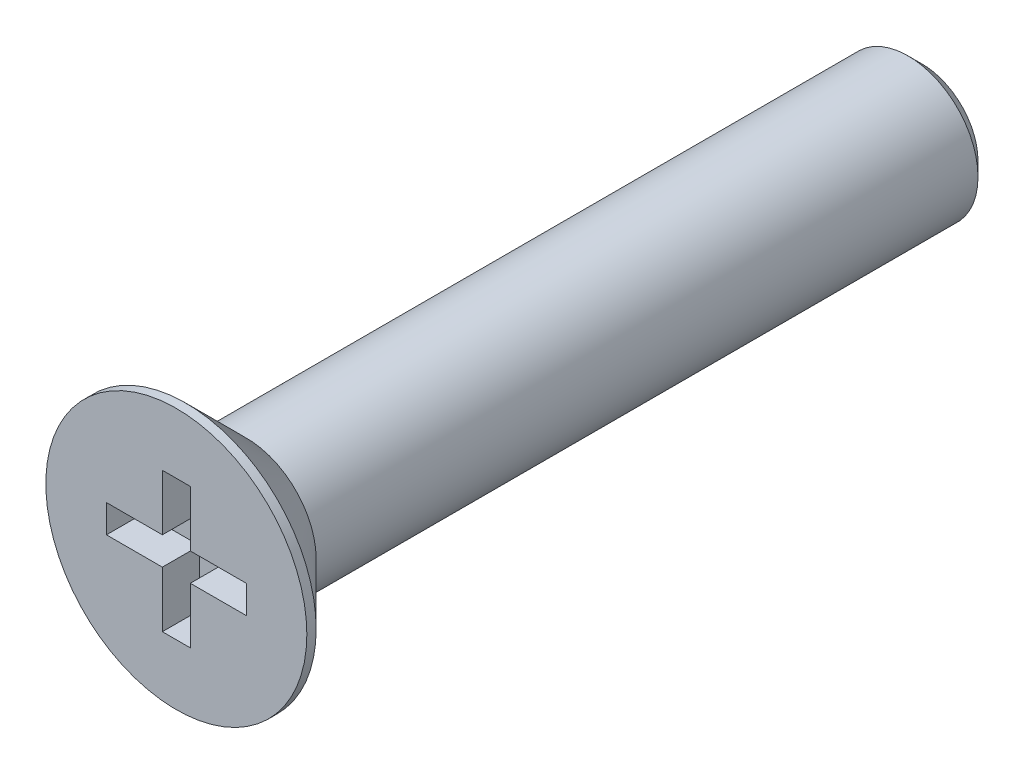
ISO-10303-21;
HEADER;
FILE_DESCRIPTION(('STEP AP214'),'2;1');
FILE_NAME('part.step','',(''),(''),'','','');
FILE_SCHEMA(('AUTOMOTIVE_DESIGN { 1 0 10303 214 1 1 1 1 }'));
ENDSEC;
DATA;
#1=APPLICATION_CONTEXT('core data for automotive mechanical design processes');
#2=APPLICATION_PROTOCOL_DEFINITION('international standard','automotive_design',2000,#1);
#3=PRODUCT_CONTEXT('',#1,'mechanical');
#4=PRODUCT('Part','Part','',(#3));
#5=PRODUCT_RELATED_PRODUCT_CATEGORY('part','',(#4));
#6=PRODUCT_DEFINITION_FORMATION('','',#4);
#7=PRODUCT_DEFINITION_CONTEXT('part definition',#1,'design');
#8=PRODUCT_DEFINITION('design','',#6,#7);
#9=PRODUCT_DEFINITION_SHAPE('','',#8);
#10=(LENGTH_UNIT() NAMED_UNIT(*) SI_UNIT(.MILLI.,.METRE.));
#11=(NAMED_UNIT(*) PLANE_ANGLE_UNIT() SI_UNIT($,.RADIAN.));
#12=(NAMED_UNIT(*) SI_UNIT($,.STERADIAN.) SOLID_ANGLE_UNIT());
#13=UNCERTAINTY_MEASURE_WITH_UNIT(LENGTH_MEASURE(1.E-05),#10,'distance_accuracy_value','');
#14=(GEOMETRIC_REPRESENTATION_CONTEXT(3) GLOBAL_UNCERTAINTY_ASSIGNED_CONTEXT((#13)) GLOBAL_UNIT_ASSIGNED_CONTEXT((#10,
#11,#12)) REPRESENTATION_CONTEXT('',''));
#15=CARTESIAN_POINT('',(0.,0.,0.));
#16=DIRECTION('',(0.,0.,1.));
#17=DIRECTION('',(1.,0.,0.));
#18=AXIS2_PLACEMENT_3D('',#15,#16,#17);
#19=CARTESIAN_POINT('',(0.,0.,0.));
#20=DIRECTION('',(0.,0.,-1.));
#21=DIRECTION('',(-1.,0.,0.));
#22=AXIS2_PLACEMENT_3D('',#19,#20,#21);
#23=PLANE('',#22);
#24=DIRECTION('',(0.,-1.,0.));
#25=VECTOR('',#24,1.);
#26=CARTESIAN_POINT('',(-1.5,-0.3,0.));
#27=LINE('',#26,#25);
#28=CARTESIAN_POINT('',(-1.5,0.3,0.));
#29=VERTEX_POINT('',#28);
#30=CARTESIAN_POINT('',(-1.5,-0.3,0.));
#31=VERTEX_POINT('',#30);
#32=EDGE_CURVE('E158',#29,#31,#27,.T.);
#33=ORIENTED_EDGE('',*,*,#32,.F.);
#34=DIRECTION('',(-1.,0.,0.));
#35=VECTOR('',#34,1.);
#36=CARTESIAN_POINT('',(-1.5,0.3,0.));
#37=LINE('',#36,#35);
#38=CARTESIAN_POINT('',(-0.3,0.3,0.));
#39=VERTEX_POINT('',#38);
#40=EDGE_CURVE('E48',#39,#29,#37,.T.);
#41=ORIENTED_EDGE('',*,*,#40,.F.);
#42=DIRECTION('',(0.,-1.,0.));
#43=VECTOR('',#42,1.);
#44=CARTESIAN_POINT('',(-0.3,0.3,0.));
#45=LINE('',#44,#43);
#46=CARTESIAN_POINT('',(-0.3,1.5,0.));
#47=VERTEX_POINT('',#46);
#48=EDGE_CURVE('E185',#47,#39,#45,.T.);
#49=ORIENTED_EDGE('',*,*,#48,.F.);
#50=DIRECTION('',(-1.,0.,0.));
#51=VECTOR('',#50,1.);
#52=CARTESIAN_POINT('',(-0.3,1.5,0.));
#53=LINE('',#52,#51);
#54=CARTESIAN_POINT('',(0.3,1.5,0.));
#55=VERTEX_POINT('',#54);
#56=EDGE_CURVE('E183',#55,#47,#53,.T.);
#57=ORIENTED_EDGE('',*,*,#56,.F.);
#58=DIRECTION('',(0.,1.,0.));
#59=VECTOR('',#58,1.);
#60=CARTESIAN_POINT('',(0.3,0.3,0.));
#61=LINE('',#60,#59);
#62=CARTESIAN_POINT('',(0.3,0.3,0.));
#63=VERTEX_POINT('',#62);
#64=EDGE_CURVE('E132',#63,#55,#61,.T.);
#65=ORIENTED_EDGE('',*,*,#64,.F.);
#66=DIRECTION('',(-1.,0.,0.));
#67=VECTOR('',#66,1.);
#68=CARTESIAN_POINT('',(1.5,0.3,0.));
#69=LINE('',#68,#67);
#70=CARTESIAN_POINT('',(1.5,0.3,0.));
#71=VERTEX_POINT('',#70);
#72=EDGE_CURVE('E179',#71,#63,#69,.T.);
#73=ORIENTED_EDGE('',*,*,#72,.F.);
#74=DIRECTION('',(0.,1.,0.));
#75=VECTOR('',#74,1.);
#76=CARTESIAN_POINT('',(1.5,-0.3,0.));
#77=LINE('',#76,#75);
#78=CARTESIAN_POINT('',(1.5,-0.3,0.));
#79=VERTEX_POINT('',#78);
#80=EDGE_CURVE('E176',#79,#71,#77,.T.);
#81=ORIENTED_EDGE('',*,*,#80,.F.);
#82=DIRECTION('',(1.,0.,0.));
#83=VECTOR('',#82,1.);
#84=CARTESIAN_POINT('',(1.5,-0.3,0.));
#85=LINE('',#84,#83);
#86=CARTESIAN_POINT('',(0.3,-0.3,0.));
#87=VERTEX_POINT('',#86);
#88=EDGE_CURVE('E173',#87,#79,#85,.T.);
#89=ORIENTED_EDGE('',*,*,#88,.F.);
#90=DIRECTION('',(0.,1.,0.));
#91=VECTOR('',#90,1.);
#92=CARTESIAN_POINT('',(0.3,-0.3,0.));
#93=LINE('',#92,#91);
#94=CARTESIAN_POINT('',(0.3,-1.5,0.));
#95=VERTEX_POINT('',#94);
#96=EDGE_CURVE('E170',#95,#87,#93,.T.);
#97=ORIENTED_EDGE('',*,*,#96,.F.);
#98=DIRECTION('',(1.,0.,0.));
#99=VECTOR('',#98,1.);
#100=CARTESIAN_POINT('',(-0.299999999999999,-1.5,0.));
#101=LINE('',#100,#99);
#102=CARTESIAN_POINT('',(-0.299999999999999,-1.5,0.));
#103=VERTEX_POINT('',#102);
#104=EDGE_CURVE('E167',#103,#95,#101,.T.);
#105=ORIENTED_EDGE('',*,*,#104,.F.);
#106=DIRECTION('',(0.,-1.,0.));
#107=VECTOR('',#106,1.);
#108=CARTESIAN_POINT('',(-0.3,-0.3,0.));
#109=LINE('',#108,#107);
#110=CARTESIAN_POINT('',(-0.3,-0.3,0.));
#111=VERTEX_POINT('',#110);
#112=EDGE_CURVE('E164',#111,#103,#109,.T.);
#113=ORIENTED_EDGE('',*,*,#112,.F.);
#114=DIRECTION('',(1.,0.,0.));
#115=VECTOR('',#114,1.);
#116=CARTESIAN_POINT('',(-1.5,-0.3,0.));
#117=LINE('',#116,#115);
#118=EDGE_CURVE('E161',#31,#111,#117,.T.);
#119=ORIENTED_EDGE('',*,*,#118,.F.);
#120=EDGE_LOOP('',(#33,#41,#49,#57,#65,#73,#81,#89,#97,#105,#113,#119));
#121=FACE_BOUND('',#120,.T.);
#122=CARTESIAN_POINT('',(0.,0.,0.));
#123=DIRECTION('',(0.,0.,1.));
#124=DIRECTION('',(1.,0.,0.));
#125=AXIS2_PLACEMENT_3D('',#122,#123,#124);
#126=CIRCLE('',#125,2.8);
#127=CARTESIAN_POINT('',(2.8,0.,0.));
#128=VERTEX_POINT('',#127);
#129=EDGE_CURVE('E212',#128,#128,#126,.T.);
#130=ORIENTED_EDGE('',*,*,#129,.T.);
#131=EDGE_LOOP('',(#130));
#132=FACE_BOUND('',#131,.T.);
#133=ADVANCED_FACE('F33',(#121,#132),#23,.F.);
#134=CARTESIAN_POINT('',(0.,0.,31.7635815070186));
#135=DIRECTION('',(0.,0.,1.));
#136=DIRECTION('',(1.,0.,0.));
#137=AXIS2_PLACEMENT_3D('',#134,#135,#136);
#138=CYLINDRICAL_SURFACE('',#137,2.8);
#139=ORIENTED_EDGE('',*,*,#129,.F.);
#140=EDGE_LOOP('',(#139));
#141=FACE_BOUND('',#140,.T.);
#142=CARTESIAN_POINT('',(0.,0.,-0.200000000000006));
#143=DIRECTION('',(0.,0.,1.));
#144=DIRECTION('',(1.,0.,0.));
#145=AXIS2_PLACEMENT_3D('',#142,#143,#144);
#146=CIRCLE('',#145,2.8);
#147=CARTESIAN_POINT('',(2.8,0.,-0.200000000000006));
#148=VERTEX_POINT('',#147);
#149=EDGE_CURVE('E209',#148,#148,#146,.T.);
#150=ORIENTED_EDGE('',*,*,#149,.T.);
#151=EDGE_LOOP('',(#150));
#152=FACE_BOUND('',#151,.T.);
#153=ADVANCED_FACE('F229',(#141,#152),#138,.T.);
#154=CARTESIAN_POINT('',(0.,0.,-1.5));
#155=DIRECTION('',(0.,0.,1.));
#156=DIRECTION('',(1.,0.,0.));
#157=AXIS2_PLACEMENT_3D('',#154,#155,#156);
#158=CONICAL_SURFACE('',#157,1.5,0.78539816339745);
#159=ORIENTED_EDGE('',*,*,#149,.F.);
#160=EDGE_LOOP('',(#159));
#161=FACE_BOUND('',#160,.T.);
#162=CARTESIAN_POINT('',(0.,0.,-1.5));
#163=DIRECTION('',(0.,0.,1.));
#164=DIRECTION('',(1.,0.,0.));
#165=AXIS2_PLACEMENT_3D('',#162,#163,#164);
#166=CIRCLE('',#165,1.5);
#167=CARTESIAN_POINT('',(1.5,0.,-1.5));
#168=VERTEX_POINT('',#167);
#169=EDGE_CURVE('E189',#168,#168,#166,.T.);
#170=ORIENTED_EDGE('',*,*,#169,.T.);
#171=EDGE_LOOP('',(#170));
#172=FACE_BOUND('',#171,.T.);
#173=ADVANCED_FACE('F234',(#161,#172),#158,.T.);
#174=CARTESIAN_POINT('',(0.,0.,31.7635815070186));
#175=DIRECTION('',(0.,0.,1.));
#176=DIRECTION('',(1.,0.,0.));
#177=AXIS2_PLACEMENT_3D('',#174,#175,#176);
#178=CYLINDRICAL_SURFACE('',#177,1.5);
#179=CARTESIAN_POINT('',(0.,0.,-15.7));
#180=DIRECTION('',(0.,0.,1.));
#181=DIRECTION('',(1.,0.,0.));
#182=AXIS2_PLACEMENT_3D('',#179,#180,#181);
#183=CIRCLE('',#182,1.5);
#184=CARTESIAN_POINT('',(1.5,0.,-15.7));
#185=VERTEX_POINT('',#184);
#186=EDGE_CURVE('E41',#185,#185,#183,.T.);
#187=ORIENTED_EDGE('',*,*,#186,.T.);
#188=EDGE_LOOP('',(#187));
#189=FACE_BOUND('',#188,.T.);
#190=ORIENTED_EDGE('',*,*,#169,.F.);
#191=EDGE_LOOP('',(#190));
#192=FACE_BOUND('',#191,.T.);
#193=ADVANCED_FACE('F217',(#189,#192),#178,.T.);
#194=CARTESIAN_POINT('',(0.,1.5,-16.));
#195=DIRECTION('',(0.,0.,1.));
#196=DIRECTION('',(1.,0.,0.));
#197=AXIS2_PLACEMENT_3D('',#194,#195,#196);
#198=PLANE('',#197);
#199=CARTESIAN_POINT('',(0.,0.,-16.));
#200=DIRECTION('',(0.,0.,1.));
#201=DIRECTION('',(1.,0.,0.));
#202=AXIS2_PLACEMENT_3D('',#199,#200,#201);
#203=CIRCLE('',#202,1.19999999999999);
#204=CARTESIAN_POINT('',(1.19999999999999,0.,-16.));
#205=VERTEX_POINT('',#204);
#206=EDGE_CURVE('E11',#205,#205,#203,.F.);
#207=ORIENTED_EDGE('',*,*,#206,.T.);
#208=EDGE_LOOP('',(#207));
#209=FACE_BOUND('',#208,.T.);
#210=ADVANCED_FACE('F245',(#209),#198,.F.);
#211=CARTESIAN_POINT('',(-1.5,0.3,-0.8));
#212=DIRECTION('',(0.,1.,0.));
#213=DIRECTION('',(-1.,0.,0.));
#214=AXIS2_PLACEMENT_3D('',#211,#212,#213);
#215=PLANE('',#214);
#216=ORIENTED_EDGE('',*,*,#40,.T.);
#217=DIRECTION('',(0.,0.,1.));
#218=VECTOR('',#217,1.);
#219=CARTESIAN_POINT('',(-1.5,0.3,-0.8));
#220=LINE('',#219,#218);
#221=CARTESIAN_POINT('',(-1.5,0.3,-0.8));
#222=VERTEX_POINT('',#221);
#223=EDGE_CURVE('E96',#222,#29,#220,.T.);
#224=ORIENTED_EDGE('',*,*,#223,.F.);
#225=DIRECTION('',(-1.,0.,0.));
#226=VECTOR('',#225,1.);
#227=CARTESIAN_POINT('',(-1.5,0.3,-0.8));
#228=LINE('',#227,#226);
#229=CARTESIAN_POINT('',(-0.3,0.3,-0.8));
#230=VERTEX_POINT('',#229);
#231=EDGE_CURVE('E187',#230,#222,#228,.T.);
#232=ORIENTED_EDGE('',*,*,#231,.F.);
#233=DIRECTION('',(0.,0.,1.));
#234=VECTOR('',#233,1.);
#235=CARTESIAN_POINT('',(-0.3,0.3,-0.8));
#236=LINE('',#235,#234);
#237=EDGE_CURVE('E56',#230,#39,#236,.T.);
#238=ORIENTED_EDGE('',*,*,#237,.T.);
#239=EDGE_LOOP('',(#216,#224,#232,#238));
#240=FACE_BOUND('',#239,.T.);
#241=ADVANCED_FACE('F248',(#240),#215,.F.);
#242=CARTESIAN_POINT('',(-0.3,0.3,-0.8));
#243=DIRECTION('',(-1.,0.,0.));
#244=DIRECTION('',(0.,-1.,0.));
#245=AXIS2_PLACEMENT_3D('',#242,#243,#244);
#246=PLANE('',#245);
#247=ORIENTED_EDGE('',*,*,#48,.T.);
#248=ORIENTED_EDGE('',*,*,#237,.F.);
#249=DIRECTION('',(0.,-1.,0.));
#250=VECTOR('',#249,1.);
#251=CARTESIAN_POINT('',(-0.3,0.3,-0.8));
#252=LINE('',#251,#250);
#253=CARTESIAN_POINT('',(-0.3,1.5,-0.8));
#254=VERTEX_POINT('',#253);
#255=EDGE_CURVE('E144',#254,#230,#252,.T.);
#256=ORIENTED_EDGE('',*,*,#255,.F.);
#257=DIRECTION('',(0.,0.,1.));
#258=VECTOR('',#257,1.);
#259=CARTESIAN_POINT('',(-0.3,1.5,-0.8));
#260=LINE('',#259,#258);
#261=EDGE_CURVE('E136',#254,#47,#260,.T.);
#262=ORIENTED_EDGE('',*,*,#261,.T.);
#263=EDGE_LOOP('',(#247,#248,#256,#262));
#264=FACE_BOUND('',#263,.T.);
#265=ADVANCED_FACE('F252',(#264),#246,.F.);
#266=CARTESIAN_POINT('',(-0.3,1.5,-0.8));
#267=DIRECTION('',(0.,1.,0.));
#268=DIRECTION('',(0.,0.,1.));
#269=AXIS2_PLACEMENT_3D('',#266,#267,#268);
#270=PLANE('',#269);
#271=ORIENTED_EDGE('',*,*,#56,.T.);
#272=ORIENTED_EDGE('',*,*,#261,.F.);
#273=DIRECTION('',(-1.,0.,0.));
#274=VECTOR('',#273,1.);
#275=CARTESIAN_POINT('',(-0.3,1.5,-0.8));
#276=LINE('',#275,#274);
#277=CARTESIAN_POINT('',(0.3,1.5,-0.8));
#278=VERTEX_POINT('',#277);
#279=EDGE_CURVE('E140',#278,#254,#276,.T.);
#280=ORIENTED_EDGE('',*,*,#279,.F.);
#281=DIRECTION('',(0.,0.,1.));
#282=VECTOR('',#281,1.);
#283=CARTESIAN_POINT('',(0.3,1.5,-0.8));
#284=LINE('',#283,#282);
#285=EDGE_CURVE('E125',#278,#55,#284,.T.);
#286=ORIENTED_EDGE('',*,*,#285,.T.);
#287=EDGE_LOOP('',(#271,#272,#280,#286));
#288=FACE_BOUND('',#287,.T.);
#289=ADVANCED_FACE('F141',(#288),#270,.F.);
#290=CARTESIAN_POINT('',(0.3,0.3,-0.8));
#291=DIRECTION('',(1.,0.,0.));
#292=DIRECTION('',(0.,1.,0.));
#293=AXIS2_PLACEMENT_3D('',#290,#291,#292);
#294=PLANE('',#293);
#295=ORIENTED_EDGE('',*,*,#64,.T.);
#296=ORIENTED_EDGE('',*,*,#285,.F.);
#297=DIRECTION('',(0.,1.,0.));
#298=VECTOR('',#297,1.);
#299=CARTESIAN_POINT('',(0.3,0.3,-0.8));
#300=LINE('',#299,#298);
#301=CARTESIAN_POINT('',(0.3,0.3,-0.8));
#302=VERTEX_POINT('',#301);
#303=EDGE_CURVE('E129',#302,#278,#300,.T.);
#304=ORIENTED_EDGE('',*,*,#303,.F.);
#305=DIRECTION('',(0.,0.,1.));
#306=VECTOR('',#305,1.);
#307=CARTESIAN_POINT('',(0.3,0.3,-0.8));
#308=LINE('',#307,#306);
#309=EDGE_CURVE('E137',#302,#63,#308,.T.);
#310=ORIENTED_EDGE('',*,*,#309,.T.);
#311=EDGE_LOOP('',(#295,#296,#304,#310));
#312=FACE_BOUND('',#311,.T.);
#313=ADVANCED_FACE('F127',(#312),#294,.F.);
#314=CARTESIAN_POINT('',(1.5,0.3,-0.8));
#315=DIRECTION('',(0.,1.,0.));
#316=DIRECTION('',(-1.,0.,0.));
#317=AXIS2_PLACEMENT_3D('',#314,#315,#316);
#318=PLANE('',#317);
#319=ORIENTED_EDGE('',*,*,#72,.T.);
#320=ORIENTED_EDGE('',*,*,#309,.F.);
#321=DIRECTION('',(-1.,0.,0.));
#322=VECTOR('',#321,1.);
#323=CARTESIAN_POINT('',(1.5,0.3,-0.8));
#324=LINE('',#323,#322);
#325=CARTESIAN_POINT('',(1.5,0.3,-0.8));
#326=VERTEX_POINT('',#325);
#327=EDGE_CURVE('E150',#326,#302,#324,.T.);
#328=ORIENTED_EDGE('',*,*,#327,.F.);
#329=DIRECTION('',(0.,0.,1.));
#330=VECTOR('',#329,1.);
#331=CARTESIAN_POINT('',(1.5,0.3,-0.8));
#332=LINE('',#331,#330);
#333=EDGE_CURVE('E192',#326,#71,#332,.T.);
#334=ORIENTED_EDGE('',*,*,#333,.T.);
#335=EDGE_LOOP('',(#319,#320,#328,#334));
#336=FACE_BOUND('',#335,.T.);
#337=ADVANCED_FACE('F279',(#336),#318,.F.);
#338=CARTESIAN_POINT('',(1.5,-0.3,-0.8));
#339=DIRECTION('',(1.,0.,0.));
#340=DIRECTION('',(0.,0.,-1.));
#341=AXIS2_PLACEMENT_3D('',#338,#339,#340);
#342=PLANE('',#341);
#343=ORIENTED_EDGE('',*,*,#80,.T.);
#344=ORIENTED_EDGE('',*,*,#333,.F.);
#345=DIRECTION('',(0.,1.,0.));
#346=VECTOR('',#345,1.);
#347=CARTESIAN_POINT('',(1.5,-0.3,-0.8));
#348=LINE('',#347,#346);
#349=CARTESIAN_POINT('',(1.5,-0.3,-0.8));
#350=VERTEX_POINT('',#349);
#351=EDGE_CURVE('E152',#350,#326,#348,.T.);
#352=ORIENTED_EDGE('',*,*,#351,.F.);
#353=DIRECTION('',(0.,0.,1.));
#354=VECTOR('',#353,1.);
#355=CARTESIAN_POINT('',(1.5,-0.3,-0.8));
#356=LINE('',#355,#354);
#357=EDGE_CURVE('E194',#350,#79,#356,.T.);
#358=ORIENTED_EDGE('',*,*,#357,.T.);
#359=EDGE_LOOP('',(#343,#344,#352,#358));
#360=FACE_BOUND('',#359,.T.);
#361=ADVANCED_FACE('F275',(#360),#342,.F.);
#362=CARTESIAN_POINT('',(1.5,-0.3,-0.8));
#363=DIRECTION('',(0.,-1.,0.));
#364=DIRECTION('',(1.,0.,0.));
#365=AXIS2_PLACEMENT_3D('',#362,#363,#364);
#366=PLANE('',#365);
#367=ORIENTED_EDGE('',*,*,#88,.T.);
#368=ORIENTED_EDGE('',*,*,#357,.F.);
#369=DIRECTION('',(1.,0.,0.));
#370=VECTOR('',#369,1.);
#371=CARTESIAN_POINT('',(1.5,-0.3,-0.8));
#372=LINE('',#371,#370);
#373=CARTESIAN_POINT('',(0.3,-0.3,-0.8));
#374=VERTEX_POINT('',#373);
#375=EDGE_CURVE('E312',#374,#350,#372,.T.);
#376=ORIENTED_EDGE('',*,*,#375,.F.);
#377=DIRECTION('',(0.,0.,1.));
#378=VECTOR('',#377,1.);
#379=CARTESIAN_POINT('',(0.3,-0.3,-0.8));
#380=LINE('',#379,#378);
#381=EDGE_CURVE('E196',#374,#87,#380,.T.);
#382=ORIENTED_EDGE('',*,*,#381,.T.);
#383=EDGE_LOOP('',(#367,#368,#376,#382));
#384=FACE_BOUND('',#383,.T.);
#385=ADVANCED_FACE('F271',(#384),#366,.F.);
#386=CARTESIAN_POINT('',(0.3,-0.3,-0.8));
#387=DIRECTION('',(1.,0.,0.));
#388=DIRECTION('',(0.,1.,0.));
#389=AXIS2_PLACEMENT_3D('',#386,#387,#388);
#390=PLANE('',#389);
#391=ORIENTED_EDGE('',*,*,#96,.T.);
#392=ORIENTED_EDGE('',*,*,#381,.F.);
#393=DIRECTION('',(0.,1.,0.));
#394=VECTOR('',#393,1.);
#395=CARTESIAN_POINT('',(0.3,-0.3,-0.8));
#396=LINE('',#395,#394);
#397=CARTESIAN_POINT('',(0.3,-1.5,-0.8));
#398=VERTEX_POINT('',#397);
#399=EDGE_CURVE('E309',#398,#374,#396,.T.);
#400=ORIENTED_EDGE('',*,*,#399,.F.);
#401=DIRECTION('',(0.,0.,1.));
#402=VECTOR('',#401,1.);
#403=CARTESIAN_POINT('',(0.3,-1.5,-0.8));
#404=LINE('',#403,#402);
#405=EDGE_CURVE('E198',#398,#95,#404,.T.);
#406=ORIENTED_EDGE('',*,*,#405,.T.);
#407=EDGE_LOOP('',(#391,#392,#400,#406));
#408=FACE_BOUND('',#407,.T.);
#409=ADVANCED_FACE('F267',(#408),#390,.F.);
#410=CARTESIAN_POINT('',(-0.299999999999999,-1.5,-0.8));
#411=DIRECTION('',(0.,-1.,0.));
#412=DIRECTION('',(0.,0.,-1.));
#413=AXIS2_PLACEMENT_3D('',#410,#411,#412);
#414=PLANE('',#413);
#415=ORIENTED_EDGE('',*,*,#104,.T.);
#416=ORIENTED_EDGE('',*,*,#405,.F.);
#417=DIRECTION('',(1.,0.,0.));
#418=VECTOR('',#417,1.);
#419=CARTESIAN_POINT('',(-0.299999999999999,-1.5,-0.8));
#420=LINE('',#419,#418);
#421=CARTESIAN_POINT('',(-0.299999999999999,-1.5,-0.8));
#422=VERTEX_POINT('',#421);
#423=EDGE_CURVE('E306',#422,#398,#420,.T.);
#424=ORIENTED_EDGE('',*,*,#423,.F.);
#425=DIRECTION('',(0.,0.,1.));
#426=VECTOR('',#425,1.);
#427=CARTESIAN_POINT('',(-0.299999999999999,-1.5,-0.8));
#428=LINE('',#427,#426);
#429=EDGE_CURVE('E200',#422,#103,#428,.T.);
#430=ORIENTED_EDGE('',*,*,#429,.T.);
#431=EDGE_LOOP('',(#415,#416,#424,#430));
#432=FACE_BOUND('',#431,.T.);
#433=ADVANCED_FACE('F263',(#432),#414,.F.);
#434=CARTESIAN_POINT('',(-0.3,-0.3,-0.8));
#435=DIRECTION('',(-1.,0.,0.));
#436=DIRECTION('',(0.,-1.,0.));
#437=AXIS2_PLACEMENT_3D('',#434,#435,#436);
#438=PLANE('',#437);
#439=ORIENTED_EDGE('',*,*,#112,.T.);
#440=ORIENTED_EDGE('',*,*,#429,.F.);
#441=DIRECTION('',(0.,-1.,0.));
#442=VECTOR('',#441,1.);
#443=CARTESIAN_POINT('',(-0.3,-0.3,-0.8));
#444=LINE('',#443,#442);
#445=CARTESIAN_POINT('',(-0.3,-0.3,-0.8));
#446=VERTEX_POINT('',#445);
#447=EDGE_CURVE('E303',#446,#422,#444,.T.);
#448=ORIENTED_EDGE('',*,*,#447,.F.);
#449=DIRECTION('',(0.,0.,1.));
#450=VECTOR('',#449,1.);
#451=CARTESIAN_POINT('',(-0.3,-0.3,-0.8));
#452=LINE('',#451,#450);
#453=EDGE_CURVE('E202',#446,#111,#452,.T.);
#454=ORIENTED_EDGE('',*,*,#453,.T.);
#455=EDGE_LOOP('',(#439,#440,#448,#454));
#456=FACE_BOUND('',#455,.T.);
#457=ADVANCED_FACE('F259',(#456),#438,.F.);
#458=CARTESIAN_POINT('',(-1.5,-0.3,-0.8));
#459=DIRECTION('',(0.,-1.,0.));
#460=DIRECTION('',(1.,0.,0.));
#461=AXIS2_PLACEMENT_3D('',#458,#459,#460);
#462=PLANE('',#461);
#463=ORIENTED_EDGE('',*,*,#118,.T.);
#464=ORIENTED_EDGE('',*,*,#453,.F.);
#465=DIRECTION('',(1.,0.,0.));
#466=VECTOR('',#465,1.);
#467=CARTESIAN_POINT('',(-1.5,-0.3,-0.8));
#468=LINE('',#467,#466);
#469=CARTESIAN_POINT('',(-1.5,-0.3,-0.8));
#470=VERTEX_POINT('',#469);
#471=EDGE_CURVE('E298',#470,#446,#468,.T.);
#472=ORIENTED_EDGE('',*,*,#471,.F.);
#473=DIRECTION('',(0.,0.,1.));
#474=VECTOR('',#473,1.);
#475=CARTESIAN_POINT('',(-1.5,-0.3,-0.8));
#476=LINE('',#475,#474);
#477=EDGE_CURVE('E204',#470,#31,#476,.T.);
#478=ORIENTED_EDGE('',*,*,#477,.T.);
#479=EDGE_LOOP('',(#463,#464,#472,#478));
#480=FACE_BOUND('',#479,.T.);
#481=ADVANCED_FACE('F255',(#480),#462,.F.);
#482=CARTESIAN_POINT('',(-1.5,-0.3,-0.8));
#483=DIRECTION('',(-1.,0.,0.));
#484=DIRECTION('',(0.,-1.,0.));
#485=AXIS2_PLACEMENT_3D('',#482,#483,#484);
#486=PLANE('',#485);
#487=ORIENTED_EDGE('',*,*,#32,.T.);
#488=ORIENTED_EDGE('',*,*,#477,.F.);
#489=DIRECTION('',(0.,-1.,0.));
#490=VECTOR('',#489,1.);
#491=CARTESIAN_POINT('',(-1.5,-0.3,-0.8));
#492=LINE('',#491,#490);
#493=EDGE_CURVE('E296',#222,#470,#492,.T.);
#494=ORIENTED_EDGE('',*,*,#493,.F.);
#495=ORIENTED_EDGE('',*,*,#223,.T.);
#496=EDGE_LOOP('',(#487,#488,#494,#495));
#497=FACE_BOUND('',#496,.T.);
#498=ADVANCED_FACE('F225',(#497),#486,.F.);
#499=CARTESIAN_POINT('',(0.,0.,-0.8));
#500=DIRECTION('',(0.,0.,1.));
#501=DIRECTION('',(1.,0.,0.));
#502=AXIS2_PLACEMENT_3D('',#499,#500,#501);
#503=PLANE('',#502);
#504=ORIENTED_EDGE('',*,*,#231,.T.);
#505=ORIENTED_EDGE('',*,*,#493,.T.);
#506=ORIENTED_EDGE('',*,*,#471,.T.);
#507=ORIENTED_EDGE('',*,*,#447,.T.);
#508=ORIENTED_EDGE('',*,*,#423,.T.);
#509=ORIENTED_EDGE('',*,*,#399,.T.);
#510=ORIENTED_EDGE('',*,*,#375,.T.);
#511=ORIENTED_EDGE('',*,*,#351,.T.);
#512=ORIENTED_EDGE('',*,*,#327,.T.);
#513=ORIENTED_EDGE('',*,*,#303,.T.);
#514=ORIENTED_EDGE('',*,*,#279,.T.);
#515=ORIENTED_EDGE('',*,*,#255,.T.);
#516=EDGE_LOOP('',(#504,#505,#506,#507,#508,#509,#510,#511,#512,#513,#514,#515));
#517=FACE_BOUND('',#516,.T.);
#518=ADVANCED_FACE('F147',(#517),#503,.T.);
#519=CARTESIAN_POINT('',(0.,0.,-15.7));
#520=DIRECTION('',(0.,0.,1.));
#521=DIRECTION('',(1.,0.,0.));
#522=AXIS2_PLACEMENT_3D('',#519,#520,#521);
#523=CONICAL_SURFACE('',#522,1.5,0.785398163397444);
#524=ORIENTED_EDGE('',*,*,#206,.F.);
#525=EDGE_LOOP('',(#524));
#526=FACE_BOUND('',#525,.T.);
#527=ORIENTED_EDGE('',*,*,#186,.F.);
#528=EDGE_LOOP('',(#527));
#529=FACE_BOUND('',#528,.T.);
#530=ADVANCED_FACE('F35',(#526,#529),#523,.T.);
#531=CLOSED_SHELL('',(#133,#153,#173,#193,#210,#241,#265,#289,#313,#337,#361,#385,#409,#433,
#457,#481,#498,#518,#530));
#532=MANIFOLD_SOLID_BREP('B2',#531);
#533=ADVANCED_BREP_SHAPE_REPRESENTATION('',(#18,#532),#14);
#534=SHAPE_DEFINITION_REPRESENTATION(#9,#533);
ENDSEC;
END-ISO-10303-21;
